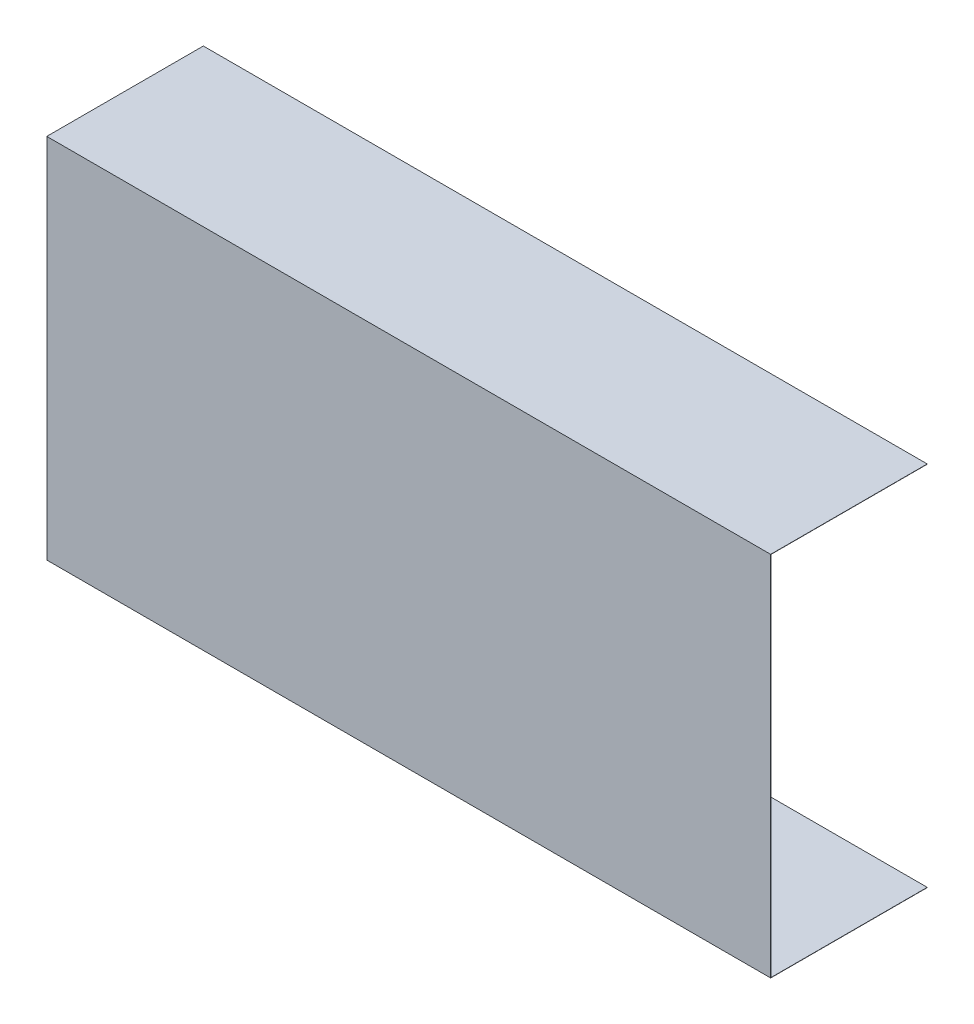
ISO-10303-21;
HEADER;
FILE_DESCRIPTION(('STEP AP214'),'2;1');
FILE_NAME('part.step','',(''),(''),'','','');
FILE_SCHEMA(('AUTOMOTIVE_DESIGN { 1 0 10303 214 1 1 1 1 }'));
ENDSEC;
DATA;
#1=APPLICATION_CONTEXT('core data for automotive mechanical design processes');
#2=APPLICATION_PROTOCOL_DEFINITION('international standard','automotive_design',2000,#1);
#3=PRODUCT_CONTEXT('',#1,'mechanical');
#4=PRODUCT('Part','Part','',(#3));
#5=PRODUCT_RELATED_PRODUCT_CATEGORY('part','',(#4));
#6=PRODUCT_DEFINITION_FORMATION('','',#4);
#7=PRODUCT_DEFINITION_CONTEXT('part definition',#1,'design');
#8=PRODUCT_DEFINITION('design','',#6,#7);
#9=PRODUCT_DEFINITION_SHAPE('','',#8);
#10=(LENGTH_UNIT() NAMED_UNIT(*) SI_UNIT(.MILLI.,.METRE.));
#11=(NAMED_UNIT(*) PLANE_ANGLE_UNIT() SI_UNIT($,.RADIAN.));
#12=(NAMED_UNIT(*) SI_UNIT($,.STERADIAN.) SOLID_ANGLE_UNIT());
#13=UNCERTAINTY_MEASURE_WITH_UNIT(LENGTH_MEASURE(1.E-05),#10,'distance_accuracy_value','');
#14=(GEOMETRIC_REPRESENTATION_CONTEXT(3) GLOBAL_UNCERTAINTY_ASSIGNED_CONTEXT((#13)) GLOBAL_UNIT_ASSIGNED_CONTEXT((#10,
#11,#12)) REPRESENTATION_CONTEXT('',''));
#15=CARTESIAN_POINT('',(0.,0.,0.));
#16=DIRECTION('',(0.,0.,1.));
#17=DIRECTION('',(1.,0.,0.));
#18=AXIS2_PLACEMENT_3D('',#15,#16,#17);
#19=CARTESIAN_POINT('',(0.,0.,0.));
#20=DIRECTION('',(0.,0.,-1.));
#21=DIRECTION('',(-1.,0.,0.));
#22=AXIS2_PLACEMENT_3D('',#19,#20,#21);
#23=PLANE('',#22);
#24=DIRECTION('',(-1.,0.,0.));
#25=VECTOR('',#24,1.);
#26=CARTESIAN_POINT('',(0.,-284.989409406542,0.));
#27=LINE('',#26,#25);
#28=CARTESIAN_POINT('',(3056.95297789217,-284.989409406542,0.));
#29=VERTEX_POINT('',#28);
#30=CARTESIAN_POINT('',(2761.0035550957,-284.989409406542,0.));
#31=VERTEX_POINT('',#30);
#32=EDGE_CURVE('E11',#29,#31,#27,.T.);
#33=ORIENTED_EDGE('',*,*,#32,.F.);
#34=DIRECTION('',(0.,1.,0.));
#35=VECTOR('',#34,1.);
#36=CARTESIAN_POINT('',(3056.95297789217,-285.089409406542,0.));
#37=LINE('',#36,#35);
#38=CARTESIAN_POINT('',(3056.95297789217,-285.089409406542,0.));
#39=VERTEX_POINT('',#38);
#40=EDGE_CURVE('E120',#39,#29,#37,.T.);
#41=ORIENTED_EDGE('',*,*,#40,.F.);
#42=DIRECTION('',(1.,0.,0.));
#43=VECTOR('',#42,1.);
#44=CARTESIAN_POINT('',(2761.0035550957,-285.089409406542,0.));
#45=LINE('',#44,#43);
#46=CARTESIAN_POINT('',(2761.0035550957,-285.089409406542,0.));
#47=VERTEX_POINT('',#46);
#48=EDGE_CURVE('E121',#47,#39,#45,.T.);
#49=ORIENTED_EDGE('',*,*,#48,.F.);
#50=DIRECTION('',(0.,-1.,0.));
#51=VECTOR('',#50,1.);
#52=CARTESIAN_POINT('',(2761.0035550957,-285.089409406542,0.));
#53=LINE('',#52,#51);
#54=EDGE_CURVE('E145',#31,#47,#53,.T.);
#55=ORIENTED_EDGE('',*,*,#54,.F.);
#56=EDGE_LOOP('',(#33,#41,#49,#55));
#57=FACE_BOUND('',#56,.T.);
#58=ADVANCED_FACE('F40',(#57),#23,.T.);
#59=CARTESIAN_POINT('',(2761.0035550957,-285.089409406542,64.));
#60=DIRECTION('',(1.,0.,0.));
#61=DIRECTION('',(0.,0.,-1.));
#62=AXIS2_PLACEMENT_3D('',#59,#60,#61);
#63=PLANE('',#62);
#64=DIRECTION('',(0.,-1.,0.));
#65=VECTOR('',#64,1.);
#66=CARTESIAN_POINT('',(2761.0035550957,-285.089409406542,63.9));
#67=LINE('',#66,#65);
#68=CARTESIAN_POINT('',(2761.0035550957,-135.189409406542,63.9));
#69=VERTEX_POINT('',#68);
#70=CARTESIAN_POINT('',(2761.0035550957,-284.989409406542,63.9));
#71=VERTEX_POINT('',#70);
#72=EDGE_CURVE('E156',#69,#71,#67,.T.);
#73=ORIENTED_EDGE('',*,*,#72,.T.);
#74=DIRECTION('',(0.,0.,-1.));
#75=VECTOR('',#74,1.);
#76=CARTESIAN_POINT('',(2761.0035550957,-284.989409406542,64.));
#77=LINE('',#76,#75);
#78=EDGE_CURVE('E158',#71,#31,#77,.T.);
#79=ORIENTED_EDGE('',*,*,#78,.T.);
#80=ORIENTED_EDGE('',*,*,#54,.T.);
#81=DIRECTION('',(0.,0.,-1.));
#82=VECTOR('',#81,1.);
#83=CARTESIAN_POINT('',(2761.0035550957,-285.089409406542,64.));
#84=LINE('',#83,#82);
#85=CARTESIAN_POINT('',(2761.0035550957,-285.089409406542,64.));
#86=VERTEX_POINT('',#85);
#87=EDGE_CURVE('E131',#86,#47,#84,.T.);
#88=ORIENTED_EDGE('',*,*,#87,.F.);
#89=DIRECTION('',(0.,-1.,0.));
#90=VECTOR('',#89,1.);
#91=CARTESIAN_POINT('',(2761.0035550957,-285.089409406542,64.));
#92=LINE('',#91,#90);
#93=CARTESIAN_POINT('',(2761.0035550957,-135.089409406542,64.));
#94=VERTEX_POINT('',#93);
#95=EDGE_CURVE('E123',#94,#86,#92,.T.);
#96=ORIENTED_EDGE('',*,*,#95,.F.);
#97=DIRECTION('',(0.,0.,-1.));
#98=VECTOR('',#97,1.);
#99=CARTESIAN_POINT('',(2761.0035550957,-135.089409406542,64.));
#100=LINE('',#99,#98);
#101=CARTESIAN_POINT('',(2761.0035550957,-135.089409406542,0.));
#102=VERTEX_POINT('',#101);
#103=EDGE_CURVE('E138',#94,#102,#100,.T.);
#104=ORIENTED_EDGE('',*,*,#103,.T.);
#105=CARTESIAN_POINT('',(2761.0035550957,-135.189409406542,0.));
#106=VERTEX_POINT('',#105);
#107=EDGE_CURVE('E124',#102,#106,#53,.T.);
#108=ORIENTED_EDGE('',*,*,#107,.T.);
#109=DIRECTION('',(0.,0.,1.));
#110=VECTOR('',#109,1.);
#111=CARTESIAN_POINT('',(2761.0035550957,-135.189409406542,64.));
#112=LINE('',#111,#110);
#113=EDGE_CURVE('E55',#106,#69,#112,.T.);
#114=ORIENTED_EDGE('',*,*,#113,.T.);
#115=EDGE_LOOP('',(#73,#79,#80,#88,#96,#104,#108,#114));
#116=FACE_BOUND('',#115,.T.);
#117=ADVANCED_FACE('F42',(#116),#63,.F.);
#118=CARTESIAN_POINT('',(2761.0035550957,-285.089409406542,64.));
#119=DIRECTION('',(0.,1.,0.));
#120=DIRECTION('',(0.,0.,1.));
#121=AXIS2_PLACEMENT_3D('',#118,#119,#120);
#122=PLANE('',#121);
#123=ORIENTED_EDGE('',*,*,#48,.T.);
#124=DIRECTION('',(0.,0.,-1.));
#125=VECTOR('',#124,1.);
#126=CARTESIAN_POINT('',(3056.95297789217,-285.089409406542,64.));
#127=LINE('',#126,#125);
#128=CARTESIAN_POINT('',(3056.95297789217,-285.089409406542,64.));
#129=VERTEX_POINT('',#128);
#130=EDGE_CURVE('E128',#129,#39,#127,.T.);
#131=ORIENTED_EDGE('',*,*,#130,.F.);
#132=DIRECTION('',(1.,0.,0.));
#133=VECTOR('',#132,1.);
#134=CARTESIAN_POINT('',(2761.0035550957,-285.089409406542,64.));
#135=LINE('',#134,#133);
#136=EDGE_CURVE('E151',#86,#129,#135,.T.);
#137=ORIENTED_EDGE('',*,*,#136,.F.);
#138=ORIENTED_EDGE('',*,*,#87,.T.);
#139=EDGE_LOOP('',(#123,#131,#137,#138));
#140=FACE_BOUND('',#139,.T.);
#141=ADVANCED_FACE('F180',(#140),#122,.F.);
#142=CARTESIAN_POINT('',(3056.95297789217,-285.089409406542,64.));
#143=DIRECTION('',(-1.,0.,0.));
#144=DIRECTION('',(0.,0.,1.));
#145=AXIS2_PLACEMENT_3D('',#142,#143,#144);
#146=PLANE('',#145);
#147=ORIENTED_EDGE('',*,*,#40,.T.);
#148=DIRECTION('',(0.,0.,-1.));
#149=VECTOR('',#148,1.);
#150=CARTESIAN_POINT('',(3056.95297789217,-284.989409406542,0.));
#151=LINE('',#150,#149);
#152=CARTESIAN_POINT('',(3056.95297789217,-284.989409406542,63.9));
#153=VERTEX_POINT('',#152);
#154=EDGE_CURVE('E165',#153,#29,#151,.T.);
#155=ORIENTED_EDGE('',*,*,#154,.F.);
#156=DIRECTION('',(0.,-1.,0.));
#157=VECTOR('',#156,1.);
#158=CARTESIAN_POINT('',(3056.95297789217,-284.989409406542,63.9));
#159=LINE('',#158,#157);
#160=CARTESIAN_POINT('',(3056.95297789217,-135.189409406542,63.9));
#161=VERTEX_POINT('',#160);
#162=EDGE_CURVE('E116',#161,#153,#159,.T.);
#163=ORIENTED_EDGE('',*,*,#162,.F.);
#164=DIRECTION('',(0.,0.,1.));
#165=VECTOR('',#164,1.);
#166=CARTESIAN_POINT('',(3056.95297789217,-135.189409406542,0.));
#167=LINE('',#166,#165);
#168=CARTESIAN_POINT('',(3056.95297789217,-135.189409406542,0.));
#169=VERTEX_POINT('',#168);
#170=EDGE_CURVE('E106',#169,#161,#167,.T.);
#171=ORIENTED_EDGE('',*,*,#170,.F.);
#172=CARTESIAN_POINT('',(3056.95297789217,-135.089409406542,0.));
#173=VERTEX_POINT('',#172);
#174=EDGE_CURVE('E63',#169,#173,#37,.T.);
#175=ORIENTED_EDGE('',*,*,#174,.T.);
#176=DIRECTION('',(0.,0.,-1.));
#177=VECTOR('',#176,1.);
#178=CARTESIAN_POINT('',(3056.95297789217,-135.089409406542,0.));
#179=LINE('',#178,#177);
#180=CARTESIAN_POINT('',(3056.95297789217,-135.089409406542,64.));
#181=VERTEX_POINT('',#180);
#182=EDGE_CURVE('E140',#181,#173,#179,.T.);
#183=ORIENTED_EDGE('',*,*,#182,.F.);
#184=DIRECTION('',(0.,1.,0.));
#185=VECTOR('',#184,1.);
#186=CARTESIAN_POINT('',(3056.95297789217,-285.089409406542,64.));
#187=LINE('',#186,#185);
#188=EDGE_CURVE('E132',#129,#181,#187,.T.);
#189=ORIENTED_EDGE('',*,*,#188,.F.);
#190=ORIENTED_EDGE('',*,*,#130,.T.);
#191=EDGE_LOOP('',(#147,#155,#163,#171,#175,#183,#189,#190));
#192=FACE_BOUND('',#191,.T.);
#193=ADVANCED_FACE('F113',(#192),#146,.F.);
#194=CARTESIAN_POINT('',(0.,0.,64.));
#195=DIRECTION('',(0.,0.,-1.));
#196=DIRECTION('',(-1.,0.,0.));
#197=AXIS2_PLACEMENT_3D('',#194,#195,#196);
#198=PLANE('',#197);
#199=ORIENTED_EDGE('',*,*,#188,.T.);
#200=DIRECTION('',(1.,0.,0.));
#201=VECTOR('',#200,1.);
#202=CARTESIAN_POINT('',(2028.62297789217,-135.089409406542,64.));
#203=LINE('',#202,#201);
#204=EDGE_CURVE('E146',#94,#181,#203,.T.);
#205=ORIENTED_EDGE('',*,*,#204,.F.);
#206=ORIENTED_EDGE('',*,*,#95,.T.);
#207=ORIENTED_EDGE('',*,*,#136,.T.);
#208=EDGE_LOOP('',(#199,#205,#206,#207));
#209=FACE_BOUND('',#208,.T.);
#210=ADVANCED_FACE('F184',(#209),#198,.F.);
#211=DIRECTION('',(1.,0.,0.));
#212=VECTOR('',#211,1.);
#213=CARTESIAN_POINT('',(0.,-135.189409406542,0.));
#214=LINE('',#213,#212);
#215=EDGE_CURVE('E48',#106,#169,#214,.T.);
#216=ORIENTED_EDGE('',*,*,#215,.F.);
#217=ORIENTED_EDGE('',*,*,#107,.F.);
#218=DIRECTION('',(-1.,0.,0.));
#219=VECTOR('',#218,1.);
#220=CARTESIAN_POINT('',(0.,-135.089409406542,0.));
#221=LINE('',#220,#219);
#222=EDGE_CURVE('E111',#173,#102,#221,.T.);
#223=ORIENTED_EDGE('',*,*,#222,.F.);
#224=ORIENTED_EDGE('',*,*,#174,.F.);
#225=EDGE_LOOP('',(#216,#217,#223,#224));
#226=FACE_BOUND('',#225,.T.);
#227=ADVANCED_FACE('F119',(#226),#23,.T.);
#228=CARTESIAN_POINT('',(2028.62297789217,-135.089409406542,0.));
#229=DIRECTION('',(0.,-1.,0.));
#230=DIRECTION('',(0.,0.,-1.));
#231=AXIS2_PLACEMENT_3D('',#228,#229,#230);
#232=PLANE('',#231);
#233=ORIENTED_EDGE('',*,*,#204,.T.);
#234=ORIENTED_EDGE('',*,*,#182,.T.);
#235=ORIENTED_EDGE('',*,*,#222,.T.);
#236=ORIENTED_EDGE('',*,*,#103,.F.);
#237=EDGE_LOOP('',(#233,#234,#235,#236));
#238=FACE_BOUND('',#237,.T.);
#239=ADVANCED_FACE('F137',(#238),#232,.F.);
#240=CARTESIAN_POINT('',(2028.62297789217,-284.989409406542,63.9));
#241=DIRECTION('',(0.,0.,1.));
#242=DIRECTION('',(1.,0.,0.));
#243=AXIS2_PLACEMENT_3D('',#240,#241,#242);
#244=PLANE('',#243);
#245=DIRECTION('',(1.,0.,0.));
#246=VECTOR('',#245,1.);
#247=CARTESIAN_POINT('',(2028.62297789217,-135.189409406542,63.9));
#248=LINE('',#247,#246);
#249=EDGE_CURVE('E163',#69,#161,#248,.T.);
#250=ORIENTED_EDGE('',*,*,#249,.T.);
#251=ORIENTED_EDGE('',*,*,#162,.T.);
#252=DIRECTION('',(1.,0.,0.));
#253=VECTOR('',#252,1.);
#254=CARTESIAN_POINT('',(2028.62297789217,-284.989409406542,63.9));
#255=LINE('',#254,#253);
#256=EDGE_CURVE('E162',#71,#153,#255,.T.);
#257=ORIENTED_EDGE('',*,*,#256,.F.);
#258=ORIENTED_EDGE('',*,*,#72,.F.);
#259=EDGE_LOOP('',(#250,#251,#257,#258));
#260=FACE_BOUND('',#259,.T.);
#261=ADVANCED_FACE('F170',(#260),#244,.F.);
#262=CARTESIAN_POINT('',(2028.62297789217,-284.989409406542,0.));
#263=DIRECTION('',(0.,-1.,0.));
#264=DIRECTION('',(0.,0.,-1.));
#265=AXIS2_PLACEMENT_3D('',#262,#263,#264);
#266=PLANE('',#265);
#267=ORIENTED_EDGE('',*,*,#256,.T.);
#268=ORIENTED_EDGE('',*,*,#154,.T.);
#269=ORIENTED_EDGE('',*,*,#32,.T.);
#270=ORIENTED_EDGE('',*,*,#78,.F.);
#271=EDGE_LOOP('',(#267,#268,#269,#270));
#272=FACE_BOUND('',#271,.T.);
#273=ADVANCED_FACE('F174',(#272),#266,.F.);
#274=CARTESIAN_POINT('',(2028.62297789217,-135.189409406542,0.));
#275=DIRECTION('',(0.,1.,0.));
#276=DIRECTION('',(0.,0.,1.));
#277=AXIS2_PLACEMENT_3D('',#274,#275,#276);
#278=PLANE('',#277);
#279=ORIENTED_EDGE('',*,*,#215,.T.);
#280=ORIENTED_EDGE('',*,*,#170,.T.);
#281=ORIENTED_EDGE('',*,*,#249,.F.);
#282=ORIENTED_EDGE('',*,*,#113,.F.);
#283=EDGE_LOOP('',(#279,#280,#281,#282));
#284=FACE_BOUND('',#283,.T.);
#285=ADVANCED_FACE('F105',(#284),#278,.F.);
#286=CLOSED_SHELL('',(#58,#117,#141,#193,#210,#227,#239,#261,#273,#285));
#287=MANIFOLD_SOLID_BREP('B2',#286);
#288=ADVANCED_BREP_SHAPE_REPRESENTATION('',(#18,#287),#14);
#289=SHAPE_DEFINITION_REPRESENTATION(#9,#288);
ENDSEC;
END-ISO-10303-21;
